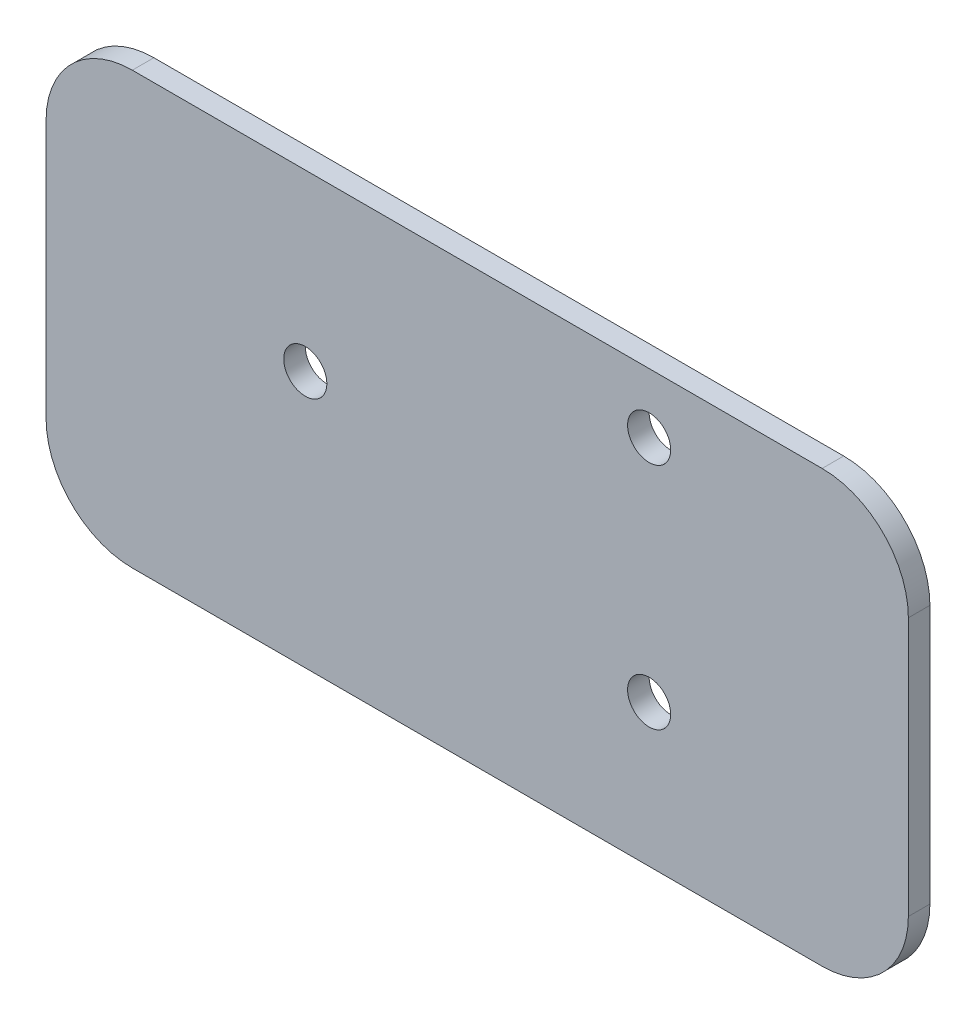
ISO-10303-21;
HEADER;
FILE_DESCRIPTION(('STEP AP214'),'2;1');
FILE_NAME('part.step','',(''),(''),'','','');
FILE_SCHEMA(('AUTOMOTIVE_DESIGN { 1 0 10303 214 1 1 1 1 }'));
ENDSEC;
DATA;
#1=APPLICATION_CONTEXT('core data for automotive mechanical design processes');
#2=APPLICATION_PROTOCOL_DEFINITION('international standard','automotive_design',2000,#1);
#3=PRODUCT_CONTEXT('',#1,'mechanical');
#4=PRODUCT('Part','Part','',(#3));
#5=PRODUCT_RELATED_PRODUCT_CATEGORY('part','',(#4));
#6=PRODUCT_DEFINITION_FORMATION('','',#4);
#7=PRODUCT_DEFINITION_CONTEXT('part definition',#1,'design');
#8=PRODUCT_DEFINITION('design','',#6,#7);
#9=PRODUCT_DEFINITION_SHAPE('','',#8);
#10=(LENGTH_UNIT() NAMED_UNIT(*) SI_UNIT(.MILLI.,.METRE.));
#11=(NAMED_UNIT(*) PLANE_ANGLE_UNIT() SI_UNIT($,.RADIAN.));
#12=(NAMED_UNIT(*) SI_UNIT($,.STERADIAN.) SOLID_ANGLE_UNIT());
#13=UNCERTAINTY_MEASURE_WITH_UNIT(LENGTH_MEASURE(1.E-05),#10,'distance_accuracy_value','');
#14=(GEOMETRIC_REPRESENTATION_CONTEXT(3) GLOBAL_UNCERTAINTY_ASSIGNED_CONTEXT((#13)) GLOBAL_UNIT_ASSIGNED_CONTEXT((#10,
#11,#12)) REPRESENTATION_CONTEXT('',''));
#15=CARTESIAN_POINT('',(0.,0.,0.));
#16=DIRECTION('',(0.,0.,1.));
#17=DIRECTION('',(1.,0.,0.));
#18=AXIS2_PLACEMENT_3D('',#15,#16,#17);
#19=CARTESIAN_POINT('',(0.,139.055716341249,3.175));
#20=DIRECTION('',(0.,1.,0.));
#21=DIRECTION('',(0.,0.,1.));
#22=AXIS2_PLACEMENT_3D('',#19,#20,#21);
#23=PLANE('',#22);
#24=DIRECTION('',(1.,0.,0.));
#25=VECTOR('',#24,1.);
#26=CARTESIAN_POINT('',(0.,139.055716341249,0.));
#27=LINE('',#26,#25);
#28=CARTESIAN_POINT('',(409.779351392055,139.055716341249,0.));
#29=VERTEX_POINT('',#28);
#30=CARTESIAN_POINT('',(511.379351392055,139.055716341249,0.));
#31=VERTEX_POINT('',#30);
#32=EDGE_CURVE('E142',#29,#31,#27,.T.);
#33=ORIENTED_EDGE('',*,*,#32,.F.);
#34=DIRECTION('',(0.,0.,-1.));
#35=VECTOR('',#34,1.);
#36=CARTESIAN_POINT('',(409.779351392055,139.055716341249,3.175));
#37=LINE('',#36,#35);
#38=CARTESIAN_POINT('',(409.779351392055,139.055716341249,3.175));
#39=VERTEX_POINT('',#38);
#40=EDGE_CURVE('E11',#39,#29,#37,.T.);
#41=ORIENTED_EDGE('',*,*,#40,.F.);
#42=DIRECTION('',(1.,0.,0.));
#43=VECTOR('',#42,1.);
#44=CARTESIAN_POINT('',(0.,139.055716341249,3.175));
#45=LINE('',#44,#43);
#46=CARTESIAN_POINT('',(511.379351392055,139.055716341249,3.175));
#47=VERTEX_POINT('',#46);
#48=EDGE_CURVE('E340',#39,#47,#45,.T.);
#49=ORIENTED_EDGE('',*,*,#48,.T.);
#50=DIRECTION('',(0.,0.,-1.));
#51=VECTOR('',#50,1.);
#52=CARTESIAN_POINT('',(511.379351392055,139.055716341249,3.175));
#53=LINE('',#52,#51);
#54=EDGE_CURVE('E56',#47,#31,#53,.T.);
#55=ORIENTED_EDGE('',*,*,#54,.T.);
#56=EDGE_LOOP('',(#33,#41,#49,#55));
#57=FACE_BOUND('',#56,.T.);
#58=ADVANCED_FACE('F39',(#57),#23,.T.);
#59=CARTESIAN_POINT('',(409.779351392055,126.355716341249,3.175));
#60=DIRECTION('',(0.,0.,-1.));
#61=DIRECTION('',(-1.,0.,0.));
#62=AXIS2_PLACEMENT_3D('',#59,#60,#61);
#63=CYLINDRICAL_SURFACE('',#62,12.7);
#64=CARTESIAN_POINT('',(409.779351392055,126.355716341249,0.));
#65=DIRECTION('',(0.,0.,1.));
#66=DIRECTION('',(1.,0.,0.));
#67=AXIS2_PLACEMENT_3D('',#64,#65,#66);
#68=CIRCLE('',#67,12.7);
#69=CARTESIAN_POINT('',(397.079351392055,126.355716341249,0.));
#70=VERTEX_POINT('',#69);
#71=EDGE_CURVE('E144',#29,#70,#68,.T.);
#72=ORIENTED_EDGE('',*,*,#71,.T.);
#73=DIRECTION('',(0.,0.,-1.));
#74=VECTOR('',#73,1.);
#75=CARTESIAN_POINT('',(397.079351392055,126.355716341249,3.175));
#76=LINE('',#75,#74);
#77=CARTESIAN_POINT('',(397.079351392055,126.355716341249,3.175));
#78=VERTEX_POINT('',#77);
#79=EDGE_CURVE('E48',#78,#70,#76,.T.);
#80=ORIENTED_EDGE('',*,*,#79,.F.);
#81=CARTESIAN_POINT('',(409.779351392055,126.355716341249,3.175));
#82=DIRECTION('',(0.,0.,1.));
#83=DIRECTION('',(1.,0.,0.));
#84=AXIS2_PLACEMENT_3D('',#81,#82,#83);
#85=CIRCLE('',#84,12.7);
#86=EDGE_CURVE('E336',#39,#78,#85,.T.);
#87=ORIENTED_EDGE('',*,*,#86,.F.);
#88=ORIENTED_EDGE('',*,*,#40,.T.);
#89=EDGE_LOOP('',(#72,#80,#87,#88));
#90=FACE_BOUND('',#89,.T.);
#91=ADVANCED_FACE('F181',(#90),#63,.T.);
#92=CARTESIAN_POINT('',(397.079351392055,5.78538895693811E-13,3.175));
#93=DIRECTION('',(1.,0.,0.));
#94=DIRECTION('',(0.,1.,0.));
#95=AXIS2_PLACEMENT_3D('',#92,#93,#94);
#96=PLANE('',#95);
#97=DIRECTION('',(0.,-1.,0.));
#98=VECTOR('',#97,1.);
#99=CARTESIAN_POINT('',(397.079351392055,5.78538895693811E-13,0.));
#100=LINE('',#99,#98);
#101=CARTESIAN_POINT('',(397.079351392055,88.2557163412488,0.));
#102=VERTEX_POINT('',#101);
#103=EDGE_CURVE('E147',#70,#102,#100,.T.);
#104=ORIENTED_EDGE('',*,*,#103,.T.);
#105=DIRECTION('',(0.,0.,-1.));
#106=VECTOR('',#105,1.);
#107=CARTESIAN_POINT('',(397.079351392055,88.2557163412488,3.175));
#108=LINE('',#107,#106);
#109=CARTESIAN_POINT('',(397.079351392055,88.2557163412488,3.175));
#110=VERTEX_POINT('',#109);
#111=EDGE_CURVE('E169',#110,#102,#108,.T.);
#112=ORIENTED_EDGE('',*,*,#111,.F.);
#113=DIRECTION('',(0.,-1.,0.));
#114=VECTOR('',#113,1.);
#115=CARTESIAN_POINT('',(397.079351392055,5.78538895693811E-13,3.175));
#116=LINE('',#115,#114);
#117=EDGE_CURVE('E177',#78,#110,#116,.T.);
#118=ORIENTED_EDGE('',*,*,#117,.F.);
#119=ORIENTED_EDGE('',*,*,#79,.T.);
#120=EDGE_LOOP('',(#104,#112,#118,#119));
#121=FACE_BOUND('',#120,.T.);
#122=ADVANCED_FACE('F174',(#121),#96,.F.);
#123=CARTESIAN_POINT('',(409.779351392055,88.2557163412488,3.175));
#124=DIRECTION('',(0.,0.,-1.));
#125=DIRECTION('',(-1.,0.,0.));
#126=AXIS2_PLACEMENT_3D('',#123,#124,#125);
#127=CYLINDRICAL_SURFACE('',#126,12.7);
#128=CARTESIAN_POINT('',(409.779351392055,88.2557163412488,0.));
#129=DIRECTION('',(0.,0.,1.));
#130=DIRECTION('',(1.,0.,0.));
#131=AXIS2_PLACEMENT_3D('',#128,#129,#130);
#132=CIRCLE('',#131,12.7);
#133=CARTESIAN_POINT('',(409.779351392055,75.5557163412488,0.));
#134=VERTEX_POINT('',#133);
#135=EDGE_CURVE('E150',#102,#134,#132,.T.);
#136=ORIENTED_EDGE('',*,*,#135,.T.);
#137=DIRECTION('',(0.,0.,-1.));
#138=VECTOR('',#137,1.);
#139=CARTESIAN_POINT('',(409.779351392055,75.5557163412488,3.175));
#140=LINE('',#139,#138);
#141=CARTESIAN_POINT('',(409.779351392055,75.5557163412488,3.175));
#142=VERTEX_POINT('',#141);
#143=EDGE_CURVE('E166',#142,#134,#140,.T.);
#144=ORIENTED_EDGE('',*,*,#143,.F.);
#145=CARTESIAN_POINT('',(409.779351392055,88.2557163412488,3.175));
#146=DIRECTION('',(0.,0.,1.));
#147=DIRECTION('',(1.,0.,0.));
#148=AXIS2_PLACEMENT_3D('',#145,#146,#147);
#149=CIRCLE('',#148,12.7);
#150=EDGE_CURVE('E334',#110,#142,#149,.T.);
#151=ORIENTED_EDGE('',*,*,#150,.F.);
#152=ORIENTED_EDGE('',*,*,#111,.T.);
#153=EDGE_LOOP('',(#136,#144,#151,#152));
#154=FACE_BOUND('',#153,.T.);
#155=ADVANCED_FACE('F230',(#154),#127,.T.);
#156=CARTESIAN_POINT('',(0.,75.5557163412487,3.175));
#157=DIRECTION('',(0.,1.,0.));
#158=DIRECTION('',(-1.,0.,0.));
#159=AXIS2_PLACEMENT_3D('',#156,#157,#158);
#160=PLANE('',#159);
#161=DIRECTION('',(1.,0.,0.));
#162=VECTOR('',#161,1.);
#163=CARTESIAN_POINT('',(0.,75.5557163412487,0.));
#164=LINE('',#163,#162);
#165=CARTESIAN_POINT('',(511.379351392055,75.5557163412488,0.));
#166=VERTEX_POINT('',#165);
#167=EDGE_CURVE('E153',#134,#166,#164,.T.);
#168=ORIENTED_EDGE('',*,*,#167,.T.);
#169=DIRECTION('',(0.,0.,-1.));
#170=VECTOR('',#169,1.);
#171=CARTESIAN_POINT('',(511.379351392055,75.5557163412488,3.175));
#172=LINE('',#171,#170);
#173=CARTESIAN_POINT('',(511.379351392055,75.5557163412488,3.175));
#174=VERTEX_POINT('',#173);
#175=EDGE_CURVE('E125',#174,#166,#172,.T.);
#176=ORIENTED_EDGE('',*,*,#175,.F.);
#177=DIRECTION('',(1.,0.,0.));
#178=VECTOR('',#177,1.);
#179=CARTESIAN_POINT('',(0.,75.5557163412487,3.175));
#180=LINE('',#179,#178);
#181=EDGE_CURVE('E114',#142,#174,#180,.T.);
#182=ORIENTED_EDGE('',*,*,#181,.F.);
#183=ORIENTED_EDGE('',*,*,#143,.T.);
#184=EDGE_LOOP('',(#168,#176,#182,#183));
#185=FACE_BOUND('',#184,.T.);
#186=ADVANCED_FACE('F227',(#185),#160,.F.);
#187=CARTESIAN_POINT('',(511.379351392055,88.2557163412488,3.175));
#188=DIRECTION('',(0.,0.,-1.));
#189=DIRECTION('',(-1.,0.,0.));
#190=AXIS2_PLACEMENT_3D('',#187,#188,#189);
#191=CYLINDRICAL_SURFACE('',#190,12.7);
#192=CARTESIAN_POINT('',(511.379351392055,88.2557163412488,0.));
#193=DIRECTION('',(0.,0.,1.));
#194=DIRECTION('',(1.,0.,0.));
#195=AXIS2_PLACEMENT_3D('',#192,#193,#194);
#196=CIRCLE('',#195,12.7);
#197=CARTESIAN_POINT('',(524.079351392055,88.2557163412488,0.));
#198=VERTEX_POINT('',#197);
#199=EDGE_CURVE('E122',#166,#198,#196,.T.);
#200=ORIENTED_EDGE('',*,*,#199,.T.);
#201=DIRECTION('',(0.,0.,-1.));
#202=VECTOR('',#201,1.);
#203=CARTESIAN_POINT('',(524.079351392055,88.2557163412488,3.175));
#204=LINE('',#203,#202);
#205=CARTESIAN_POINT('',(524.079351392055,88.2557163412488,3.175));
#206=VERTEX_POINT('',#205);
#207=EDGE_CURVE('E120',#206,#198,#204,.T.);
#208=ORIENTED_EDGE('',*,*,#207,.F.);
#209=CARTESIAN_POINT('',(511.379351392055,88.2557163412488,3.175));
#210=DIRECTION('',(0.,0.,1.));
#211=DIRECTION('',(1.,0.,0.));
#212=AXIS2_PLACEMENT_3D('',#209,#210,#211);
#213=CIRCLE('',#212,12.7);
#214=EDGE_CURVE('E106',#174,#206,#213,.T.);
#215=ORIENTED_EDGE('',*,*,#214,.F.);
#216=ORIENTED_EDGE('',*,*,#175,.T.);
#217=EDGE_LOOP('',(#200,#208,#215,#216));
#218=FACE_BOUND('',#217,.T.);
#219=ADVANCED_FACE('F121',(#218),#191,.T.);
#220=CARTESIAN_POINT('',(524.079351392055,0.,3.175));
#221=DIRECTION('',(1.,0.,0.));
#222=DIRECTION('',(0.,0.,-1.));
#223=AXIS2_PLACEMENT_3D('',#220,#221,#222);
#224=PLANE('',#223);
#225=DIRECTION('',(0.,-1.,0.));
#226=VECTOR('',#225,1.);
#227=CARTESIAN_POINT('',(524.079351392055,0.,0.));
#228=LINE('',#227,#226);
#229=CARTESIAN_POINT('',(524.079351392055,126.355716341249,0.));
#230=VERTEX_POINT('',#229);
#231=EDGE_CURVE('E157',#230,#198,#228,.T.);
#232=ORIENTED_EDGE('',*,*,#231,.F.);
#233=DIRECTION('',(0.,0.,-1.));
#234=VECTOR('',#233,1.);
#235=CARTESIAN_POINT('',(524.079351392055,126.355716341249,3.175));
#236=LINE('',#235,#234);
#237=CARTESIAN_POINT('',(524.079351392055,126.355716341249,3.175));
#238=VERTEX_POINT('',#237);
#239=EDGE_CURVE('E81',#238,#230,#236,.T.);
#240=ORIENTED_EDGE('',*,*,#239,.F.);
#241=DIRECTION('',(0.,-1.,0.));
#242=VECTOR('',#241,1.);
#243=CARTESIAN_POINT('',(524.079351392055,0.,3.175));
#244=LINE('',#243,#242);
#245=EDGE_CURVE('E112',#238,#206,#244,.T.);
#246=ORIENTED_EDGE('',*,*,#245,.T.);
#247=ORIENTED_EDGE('',*,*,#207,.T.);
#248=EDGE_LOOP('',(#232,#240,#246,#247));
#249=FACE_BOUND('',#248,.T.);
#250=ADVANCED_FACE('F127',(#249),#224,.T.);
#251=CARTESIAN_POINT('',(435.255534848016,113.379343598158,3.175));
#252=DIRECTION('',(0.,0.,-1.));
#253=DIRECTION('',(-1.,0.,0.));
#254=AXIS2_PLACEMENT_3D('',#251,#252,#253);
#255=CYLINDRICAL_SURFACE('',#254,3.17500000000009);
#256=CARTESIAN_POINT('',(435.255534848016,113.379343598158,3.175));
#257=DIRECTION('',(0.,0.,1.));
#258=DIRECTION('',(1.,0.,0.));
#259=AXIS2_PLACEMENT_3D('',#256,#257,#258);
#260=CIRCLE('',#259,3.17500000000009);
#261=CARTESIAN_POINT('',(438.430534848016,113.379343598158,3.175));
#262=VERTEX_POINT('',#261);
#263=EDGE_CURVE('E342',#262,#262,#260,.T.);
#264=ORIENTED_EDGE('',*,*,#263,.T.);
#265=EDGE_LOOP('',(#264));
#266=FACE_BOUND('',#265,.T.);
#267=CARTESIAN_POINT('',(435.255534848016,113.379343598158,0.));
#268=DIRECTION('',(0.,0.,1.));
#269=DIRECTION('',(1.,0.,0.));
#270=AXIS2_PLACEMENT_3D('',#267,#268,#269);
#271=CIRCLE('',#270,3.17500000000009);
#272=CARTESIAN_POINT('',(438.430534848016,113.379343598158,0.));
#273=VERTEX_POINT('',#272);
#274=EDGE_CURVE('E139',#273,#273,#271,.T.);
#275=ORIENTED_EDGE('',*,*,#274,.F.);
#276=EDGE_LOOP('',(#275));
#277=FACE_BOUND('',#276,.T.);
#278=ADVANCED_FACE('F192',(#266,#277),#255,.F.);
#279=CARTESIAN_POINT('',(485.903167936094,96.5107163412532,3.175));
#280=DIRECTION('',(0.,0.,-1.));
#281=DIRECTION('',(-1.,0.,0.));
#282=AXIS2_PLACEMENT_3D('',#279,#280,#281);
#283=CYLINDRICAL_SURFACE('',#282,3.17500000000009);
#284=CARTESIAN_POINT('',(485.903167936094,96.5107163412532,3.175));
#285=DIRECTION('',(0.,0.,1.));
#286=DIRECTION('',(1.,0.,0.));
#287=AXIS2_PLACEMENT_3D('',#284,#285,#286);
#288=CIRCLE('',#287,3.17500000000009);
#289=CARTESIAN_POINT('',(489.078167936094,96.5107163412532,3.175));
#290=VERTEX_POINT('',#289);
#291=EDGE_CURVE('E206',#290,#290,#288,.T.);
#292=ORIENTED_EDGE('',*,*,#291,.T.);
#293=EDGE_LOOP('',(#292));
#294=FACE_BOUND('',#293,.T.);
#295=CARTESIAN_POINT('',(485.903167936094,96.5107163412532,0.));
#296=DIRECTION('',(0.,0.,1.));
#297=DIRECTION('',(1.,0.,0.));
#298=AXIS2_PLACEMENT_3D('',#295,#296,#297);
#299=CIRCLE('',#298,3.17500000000009);
#300=CARTESIAN_POINT('',(489.078167936094,96.5107163412532,0.));
#301=VERTEX_POINT('',#300);
#302=EDGE_CURVE('E136',#301,#301,#299,.T.);
#303=ORIENTED_EDGE('',*,*,#302,.F.);
#304=EDGE_LOOP('',(#303));
#305=FACE_BOUND('',#304,.T.);
#306=ADVANCED_FACE('F194',(#294,#305),#283,.F.);
#307=CARTESIAN_POINT('',(485.903167936094,130.247970855064,3.175));
#308=DIRECTION('',(0.,0.,-1.));
#309=DIRECTION('',(-1.,0.,0.));
#310=AXIS2_PLACEMENT_3D('',#307,#308,#309);
#311=CYLINDRICAL_SURFACE('',#310,3.17500000000009);
#312=CARTESIAN_POINT('',(485.903167936094,130.247970855064,3.175));
#313=DIRECTION('',(0.,0.,1.));
#314=DIRECTION('',(1.,0.,0.));
#315=AXIS2_PLACEMENT_3D('',#312,#313,#314);
#316=CIRCLE('',#315,3.17500000000009);
#317=CARTESIAN_POINT('',(489.078167936094,130.247970855064,3.175));
#318=VERTEX_POINT('',#317);
#319=EDGE_CURVE('E162',#318,#318,#316,.T.);
#320=ORIENTED_EDGE('',*,*,#319,.T.);
#321=EDGE_LOOP('',(#320));
#322=FACE_BOUND('',#321,.T.);
#323=CARTESIAN_POINT('',(485.903167936094,130.247970855064,0.));
#324=DIRECTION('',(0.,0.,1.));
#325=DIRECTION('',(1.,0.,0.));
#326=AXIS2_PLACEMENT_3D('',#323,#324,#325);
#327=CIRCLE('',#326,3.17500000000009);
#328=CARTESIAN_POINT('',(489.078167936094,130.247970855064,0.));
#329=VERTEX_POINT('',#328);
#330=EDGE_CURVE('E133',#329,#329,#327,.T.);
#331=ORIENTED_EDGE('',*,*,#330,.F.);
#332=EDGE_LOOP('',(#331));
#333=FACE_BOUND('',#332,.T.);
#334=ADVANCED_FACE('F41',(#322,#333),#311,.F.);
#335=CARTESIAN_POINT('',(511.379351392055,126.355716341249,3.175));
#336=DIRECTION('',(0.,0.,-1.));
#337=DIRECTION('',(-1.,0.,0.));
#338=AXIS2_PLACEMENT_3D('',#335,#336,#337);
#339=CYLINDRICAL_SURFACE('',#338,12.7);
#340=CARTESIAN_POINT('',(511.379351392055,126.355716341249,0.));
#341=DIRECTION('',(0.,0.,1.));
#342=DIRECTION('',(1.,0.,0.));
#343=AXIS2_PLACEMENT_3D('',#340,#341,#342);
#344=CIRCLE('',#343,12.7);
#345=EDGE_CURVE('E159',#31,#230,#344,.F.);
#346=ORIENTED_EDGE('',*,*,#345,.F.);
#347=ORIENTED_EDGE('',*,*,#54,.F.);
#348=CARTESIAN_POINT('',(511.379351392055,126.355716341249,3.175));
#349=DIRECTION('',(0.,0.,1.));
#350=DIRECTION('',(1.,0.,0.));
#351=AXIS2_PLACEMENT_3D('',#348,#349,#350);
#352=CIRCLE('',#351,12.7);
#353=EDGE_CURVE('E128',#47,#238,#352,.F.);
#354=ORIENTED_EDGE('',*,*,#353,.T.);
#355=ORIENTED_EDGE('',*,*,#239,.T.);
#356=EDGE_LOOP('',(#346,#347,#354,#355));
#357=FACE_BOUND('',#356,.T.);
#358=ADVANCED_FACE('F201',(#357),#339,.T.);
#359=CARTESIAN_POINT('',(0.,0.,3.175));
#360=DIRECTION('',(0.,0.,1.));
#361=DIRECTION('',(1.,0.,0.));
#362=AXIS2_PLACEMENT_3D('',#359,#360,#361);
#363=PLANE('',#362);
#364=ORIENTED_EDGE('',*,*,#319,.F.);
#365=EDGE_LOOP('',(#364));
#366=FACE_BOUND('',#365,.T.);
#367=ORIENTED_EDGE('',*,*,#291,.F.);
#368=EDGE_LOOP('',(#367));
#369=FACE_BOUND('',#368,.T.);
#370=ORIENTED_EDGE('',*,*,#263,.F.);
#371=EDGE_LOOP('',(#370));
#372=FACE_BOUND('',#371,.T.);
#373=ORIENTED_EDGE('',*,*,#48,.F.);
#374=ORIENTED_EDGE('',*,*,#86,.T.);
#375=ORIENTED_EDGE('',*,*,#117,.T.);
#376=ORIENTED_EDGE('',*,*,#150,.T.);
#377=ORIENTED_EDGE('',*,*,#181,.T.);
#378=ORIENTED_EDGE('',*,*,#214,.T.);
#379=ORIENTED_EDGE('',*,*,#245,.F.);
#380=ORIENTED_EDGE('',*,*,#353,.F.);
#381=EDGE_LOOP('',(#373,#374,#375,#376,#377,#378,#379,#380));
#382=FACE_BOUND('',#381,.T.);
#383=ADVANCED_FACE('F109',(#366,#369,#372,#382),#363,.T.);
#384=CARTESIAN_POINT('',(0.,0.,0.));
#385=DIRECTION('',(0.,0.,1.));
#386=DIRECTION('',(1.,0.,0.));
#387=AXIS2_PLACEMENT_3D('',#384,#385,#386);
#388=PLANE('',#387);
#389=ORIENTED_EDGE('',*,*,#330,.T.);
#390=EDGE_LOOP('',(#389));
#391=FACE_BOUND('',#390,.T.);
#392=ORIENTED_EDGE('',*,*,#302,.T.);
#393=EDGE_LOOP('',(#392));
#394=FACE_BOUND('',#393,.T.);
#395=ORIENTED_EDGE('',*,*,#274,.T.);
#396=EDGE_LOOP('',(#395));
#397=FACE_BOUND('',#396,.T.);
#398=ORIENTED_EDGE('',*,*,#32,.T.);
#399=ORIENTED_EDGE('',*,*,#345,.T.);
#400=ORIENTED_EDGE('',*,*,#231,.T.);
#401=ORIENTED_EDGE('',*,*,#199,.F.);
#402=ORIENTED_EDGE('',*,*,#167,.F.);
#403=ORIENTED_EDGE('',*,*,#135,.F.);
#404=ORIENTED_EDGE('',*,*,#103,.F.);
#405=ORIENTED_EDGE('',*,*,#71,.F.);
#406=EDGE_LOOP('',(#398,#399,#400,#401,#402,#403,#404,#405));
#407=FACE_BOUND('',#406,.T.);
#408=ADVANCED_FACE('F183',(#391,#394,#397,#407),#388,.F.);
#409=CLOSED_SHELL('',(#58,#91,#122,#155,#186,#219,#250,#278,#306,#334,#358,#383,#408));
#410=MANIFOLD_SOLID_BREP('B2',#409);
#411=ADVANCED_BREP_SHAPE_REPRESENTATION('',(#18,#410),#14);
#412=SHAPE_DEFINITION_REPRESENTATION(#9,#411);
ENDSEC;
END-ISO-10303-21;
